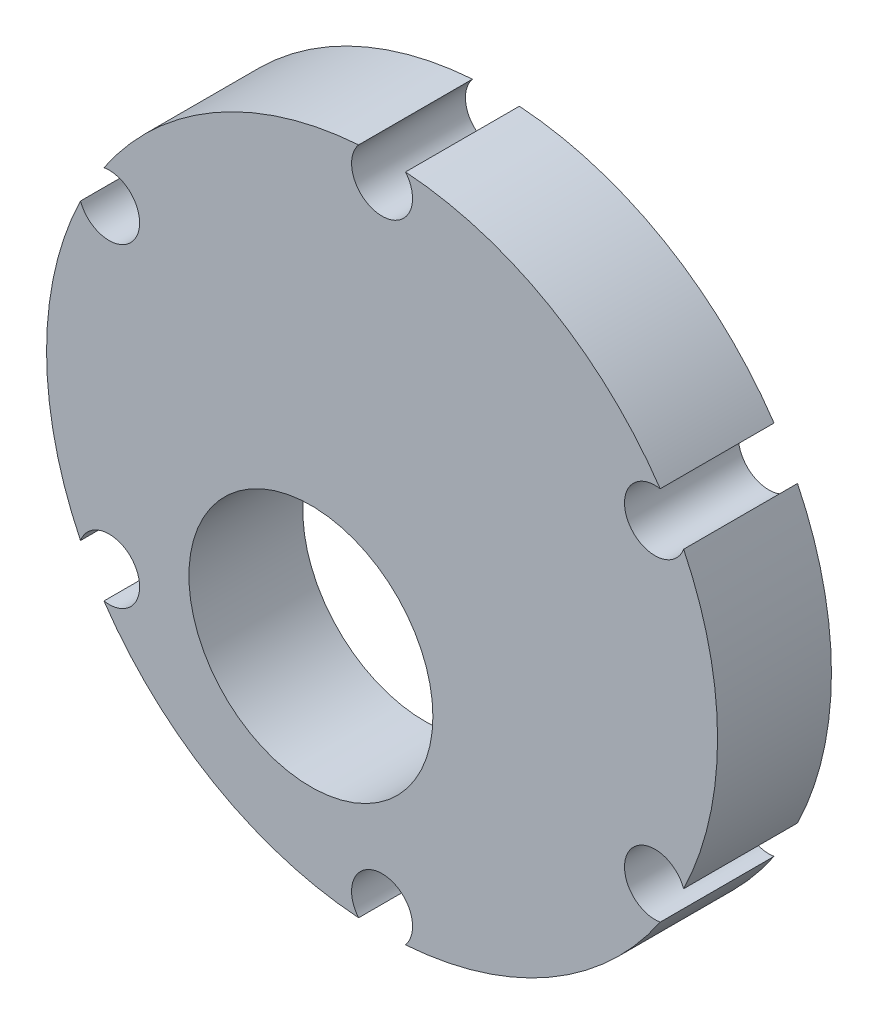
ISO-10303-21;
HEADER;
FILE_DESCRIPTION(('STEP AP214'),'2;1');
FILE_NAME('part.step','',(''),(''),'','','');
FILE_SCHEMA(('AUTOMOTIVE_DESIGN { 1 0 10303 214 1 1 1 1 }'));
ENDSEC;
DATA;
#1=APPLICATION_CONTEXT('core data for automotive mechanical design processes');
#2=APPLICATION_PROTOCOL_DEFINITION('international standard','automotive_design',2000,#1);
#3=PRODUCT_CONTEXT('',#1,'mechanical');
#4=PRODUCT('Part','Part','',(#3));
#5=PRODUCT_RELATED_PRODUCT_CATEGORY('part','',(#4));
#6=PRODUCT_DEFINITION_FORMATION('','',#4);
#7=PRODUCT_DEFINITION_CONTEXT('part definition',#1,'design');
#8=PRODUCT_DEFINITION('design','',#6,#7);
#9=PRODUCT_DEFINITION_SHAPE('','',#8);
#10=(LENGTH_UNIT() NAMED_UNIT(*) SI_UNIT(.MILLI.,.METRE.));
#11=(NAMED_UNIT(*) PLANE_ANGLE_UNIT() SI_UNIT($,.RADIAN.));
#12=(NAMED_UNIT(*) SI_UNIT($,.STERADIAN.) SOLID_ANGLE_UNIT());
#13=UNCERTAINTY_MEASURE_WITH_UNIT(LENGTH_MEASURE(1.E-05),#10,'distance_accuracy_value','');
#14=(GEOMETRIC_REPRESENTATION_CONTEXT(3) GLOBAL_UNCERTAINTY_ASSIGNED_CONTEXT((#13)) GLOBAL_UNIT_ASSIGNED_CONTEXT((#10,
#11,#12)) REPRESENTATION_CONTEXT('',''));
#15=CARTESIAN_POINT('',(0.,0.,0.));
#16=DIRECTION('',(0.,0.,1.));
#17=DIRECTION('',(1.,0.,0.));
#18=AXIS2_PLACEMENT_3D('',#15,#16,#17);
#19=CARTESIAN_POINT('',(0.,0.,5.6));
#20=DIRECTION('',(0.,0.,-1.));
#21=DIRECTION('',(-1.,0.,0.));
#22=AXIS2_PLACEMENT_3D('',#19,#20,#21);
#23=CYLINDRICAL_SURFACE('',#22,16.5);
#24=CARTESIAN_POINT('',(0.,0.,0.));
#25=DIRECTION('',(0.,0.,1.));
#26=DIRECTION('',(1.,0.,0.));
#27=AXIS2_PLACEMENT_3D('',#24,#25,#26);
#28=CIRCLE('',#27,16.5);
#29=CARTESIAN_POINT('',(14.8309142694271,-7.23145780136368,0.));
#30=VERTEX_POINT('',#29);
#31=CARTESIAN_POINT('',(14.8309142694271,7.23145780136372,0.));
#32=VERTEX_POINT('',#31);
#33=EDGE_CURVE('E212',#30,#32,#28,.T.);
#34=ORIENTED_EDGE('',*,*,#33,.T.);
#35=DIRECTION('',(0.,0.,1.));
#36=VECTOR('',#35,1.);
#37=CARTESIAN_POINT('',(14.8309142694271,7.23145780136372,2.8));
#38=LINE('',#37,#36);
#39=CARTESIAN_POINT('',(14.8309142694271,7.23145780136372,5.6));
#40=VERTEX_POINT('',#39);
#41=EDGE_CURVE('E48',#32,#40,#38,.T.);
#42=ORIENTED_EDGE('',*,*,#41,.T.);
#43=CARTESIAN_POINT('',(0.,0.,5.6));
#44=DIRECTION('',(0.,0.,1.));
#45=DIRECTION('',(1.,0.,0.));
#46=AXIS2_PLACEMENT_3D('',#43,#44,#45);
#47=CIRCLE('',#46,16.5);
#48=CARTESIAN_POINT('',(14.8309142694271,-7.23145780136368,5.6));
#49=VERTEX_POINT('',#48);
#50=EDGE_CURVE('E165',#49,#40,#47,.T.);
#51=ORIENTED_EDGE('',*,*,#50,.F.);
#52=DIRECTION('',(0.,0.,1.));
#53=VECTOR('',#52,1.);
#54=CARTESIAN_POINT('',(14.8309142694271,-7.23145780136368,2.8));
#55=LINE('',#54,#53);
#56=EDGE_CURVE('E189',#49,#30,#55,.F.);
#57=ORIENTED_EDGE('',*,*,#56,.T.);
#58=EDGE_LOOP('',(#34,#42,#51,#57));
#59=FACE_BOUND('',#58,.T.);
#60=ADVANCED_FACE('F33',(#59),#23,.T.);
#61=CARTESIAN_POINT('',(1.15283097233743,-16.4596774193548,0.));
#62=VERTEX_POINT('',#61);
#63=CARTESIAN_POINT('',(13.6780832970897,-9.22821961799116,0.));
#64=VERTEX_POINT('',#63);
#65=EDGE_CURVE('E154',#62,#64,#28,.T.);
#66=ORIENTED_EDGE('',*,*,#65,.T.);
#67=DIRECTION('',(0.,0.,1.));
#68=VECTOR('',#67,1.);
#69=CARTESIAN_POINT('',(13.6780832970897,-9.22821961799114,2.8));
#70=LINE('',#69,#68);
#71=CARTESIAN_POINT('',(13.6780832970897,-9.22821961799114,5.6));
#72=VERTEX_POINT('',#71);
#73=EDGE_CURVE('E56',#64,#72,#70,.T.);
#74=ORIENTED_EDGE('',*,*,#73,.T.);
#75=CARTESIAN_POINT('',(1.15283097233743,-16.4596774193548,5.6));
#76=VERTEX_POINT('',#75);
#77=EDGE_CURVE('E170',#76,#72,#47,.T.);
#78=ORIENTED_EDGE('',*,*,#77,.F.);
#79=DIRECTION('',(0.,0.,1.));
#80=VECTOR('',#79,1.);
#81=CARTESIAN_POINT('',(1.15283097233743,-16.4596774193548,2.8));
#82=LINE('',#81,#80);
#83=EDGE_CURVE('E190',#76,#62,#82,.F.);
#84=ORIENTED_EDGE('',*,*,#83,.T.);
#85=EDGE_LOOP('',(#66,#74,#78,#84));
#86=FACE_BOUND('',#85,.T.);
#87=ADVANCED_FACE('F219',(#86),#23,.T.);
#88=CARTESIAN_POINT('',(-13.6780832970896,-9.22821961799115,0.));
#89=VERTEX_POINT('',#88);
#90=CARTESIAN_POINT('',(-1.15283097233744,-16.4596774193548,0.));
#91=VERTEX_POINT('',#90);
#92=EDGE_CURVE('E149',#89,#91,#28,.T.);
#93=ORIENTED_EDGE('',*,*,#92,.T.);
#94=DIRECTION('',(0.,0.,1.));
#95=VECTOR('',#94,1.);
#96=CARTESIAN_POINT('',(-1.15283097233743,-16.4596774193548,2.8));
#97=LINE('',#96,#95);
#98=CARTESIAN_POINT('',(-1.15283097233743,-16.4596774193548,5.6));
#99=VERTEX_POINT('',#98);
#100=EDGE_CURVE('E187',#91,#99,#97,.T.);
#101=ORIENTED_EDGE('',*,*,#100,.T.);
#102=CARTESIAN_POINT('',(-13.6780832970896,-9.22821961799115,5.6));
#103=VERTEX_POINT('',#102);
#104=EDGE_CURVE('E164',#103,#99,#47,.T.);
#105=ORIENTED_EDGE('',*,*,#104,.F.);
#106=DIRECTION('',(0.,0.,1.));
#107=VECTOR('',#106,1.);
#108=CARTESIAN_POINT('',(-13.6780832970896,-9.22821961799115,2.8));
#109=LINE('',#108,#107);
#110=EDGE_CURVE('E186',#103,#89,#109,.F.);
#111=ORIENTED_EDGE('',*,*,#110,.T.);
#112=EDGE_LOOP('',(#93,#101,#105,#111));
#113=FACE_BOUND('',#112,.T.);
#114=ADVANCED_FACE('F185',(#113),#23,.T.);
#115=CARTESIAN_POINT('',(-14.8309142694271,7.23145780136367,0.));
#116=VERTEX_POINT('',#115);
#117=CARTESIAN_POINT('',(-14.8309142694271,-7.23145780136368,0.));
#118=VERTEX_POINT('',#117);
#119=EDGE_CURVE('E139',#116,#118,#28,.T.);
#120=ORIENTED_EDGE('',*,*,#119,.T.);
#121=DIRECTION('',(0.,0.,1.));
#122=VECTOR('',#121,1.);
#123=CARTESIAN_POINT('',(-14.8309142694271,-7.23145780136369,2.8));
#124=LINE('',#123,#122);
#125=CARTESIAN_POINT('',(-14.8309142694271,-7.23145780136369,5.6));
#126=VERTEX_POINT('',#125);
#127=EDGE_CURVE('E195',#118,#126,#124,.T.);
#128=ORIENTED_EDGE('',*,*,#127,.T.);
#129=CARTESIAN_POINT('',(-14.8309142694271,7.23145780136367,5.6));
#130=VERTEX_POINT('',#129);
#131=EDGE_CURVE('E141',#130,#126,#47,.T.);
#132=ORIENTED_EDGE('',*,*,#131,.F.);
#133=DIRECTION('',(0.,0.,1.));
#134=VECTOR('',#133,1.);
#135=CARTESIAN_POINT('',(-14.8309142694271,7.23145780136367,2.8));
#136=LINE('',#135,#134);
#137=EDGE_CURVE('E124',#130,#116,#136,.F.);
#138=ORIENTED_EDGE('',*,*,#137,.T.);
#139=EDGE_LOOP('',(#120,#128,#132,#138));
#140=FACE_BOUND('',#139,.T.);
#141=ADVANCED_FACE('F137',(#140),#23,.T.);
#142=CARTESIAN_POINT('',(-1.15283097233743,16.4596774193548,0.));
#143=VERTEX_POINT('',#142);
#144=CARTESIAN_POINT('',(-13.6780832970897,9.22821961799115,0.));
#145=VERTEX_POINT('',#144);
#146=EDGE_CURVE('E148',#143,#145,#28,.T.);
#147=ORIENTED_EDGE('',*,*,#146,.T.);
#148=DIRECTION('',(0.,0.,1.));
#149=VECTOR('',#148,1.);
#150=CARTESIAN_POINT('',(-13.6780832970897,9.22821961799113,2.8));
#151=LINE('',#150,#149);
#152=CARTESIAN_POINT('',(-13.6780832970897,9.22821961799113,5.6));
#153=VERTEX_POINT('',#152);
#154=EDGE_CURVE('E127',#145,#153,#151,.T.);
#155=ORIENTED_EDGE('',*,*,#154,.T.);
#156=CARTESIAN_POINT('',(-1.15283097233743,16.4596774193548,5.6));
#157=VERTEX_POINT('',#156);
#158=EDGE_CURVE('E157',#157,#153,#47,.T.);
#159=ORIENTED_EDGE('',*,*,#158,.F.);
#160=DIRECTION('',(0.,0.,1.));
#161=VECTOR('',#160,1.);
#162=CARTESIAN_POINT('',(-1.15283097233743,16.4596774193548,2.8));
#163=LINE('',#162,#161);
#164=EDGE_CURVE('E206',#157,#143,#163,.F.);
#165=ORIENTED_EDGE('',*,*,#164,.T.);
#166=EDGE_LOOP('',(#147,#155,#159,#165));
#167=FACE_BOUND('',#166,.T.);
#168=ADVANCED_FACE('F236',(#167),#23,.T.);
#169=CARTESIAN_POINT('',(13.6780832970897,9.22821961799114,5.6));
#170=VERTEX_POINT('',#169);
#171=CARTESIAN_POINT('',(1.15283097233743,16.4596774193548,5.6));
#172=VERTEX_POINT('',#171);
#173=EDGE_CURVE('E151',#170,#172,#47,.T.);
#174=ORIENTED_EDGE('',*,*,#173,.F.);
#175=DIRECTION('',(0.,0.,1.));
#176=VECTOR('',#175,1.);
#177=CARTESIAN_POINT('',(13.6780832970897,9.22821961799114,2.8));
#178=LINE('',#177,#176);
#179=CARTESIAN_POINT('',(13.6780832970897,9.22821961799114,0.));
#180=VERTEX_POINT('',#179);
#181=EDGE_CURVE('E200',#170,#180,#178,.F.);
#182=ORIENTED_EDGE('',*,*,#181,.T.);
#183=CARTESIAN_POINT('',(1.15283097233744,16.4596774193548,0.));
#184=VERTEX_POINT('',#183);
#185=EDGE_CURVE('E152',#180,#184,#28,.T.);
#186=ORIENTED_EDGE('',*,*,#185,.T.);
#187=DIRECTION('',(0.,0.,1.));
#188=VECTOR('',#187,1.);
#189=CARTESIAN_POINT('',(1.15283097233743,16.4596774193548,2.8));
#190=LINE('',#189,#188);
#191=EDGE_CURVE('E208',#184,#172,#190,.T.);
#192=ORIENTED_EDGE('',*,*,#191,.T.);
#193=EDGE_LOOP('',(#174,#182,#186,#192));
#194=FACE_BOUND('',#193,.T.);
#195=ADVANCED_FACE('F35',(#194),#23,.T.);
#196=CARTESIAN_POINT('',(0.,0.,5.6));
#197=DIRECTION('',(0.,0.,1.));
#198=DIRECTION('',(1.,0.,0.));
#199=AXIS2_PLACEMENT_3D('',#196,#197,#198);
#200=PLANE('',#199);
#201=CARTESIAN_POINT('',(-3.49999999999996,-6.06217782649109,5.6));
#202=DIRECTION('',(0.,0.,1.));
#203=DIRECTION('',(1.,0.,0.));
#204=AXIS2_PLACEMENT_3D('',#201,#202,#203);
#205=CIRCLE('',#204,6.);
#206=CARTESIAN_POINT('',(2.50000000000004,-6.06217782649109,5.6));
#207=VERTEX_POINT('',#206);
#208=EDGE_CURVE('E260',#207,#207,#205,.T.);
#209=ORIENTED_EDGE('',*,*,#208,.F.);
#210=EDGE_LOOP('',(#209));
#211=FACE_BOUND('',#210,.T.);
#212=CARTESIAN_POINT('',(13.4233937586588,7.75,5.6));
#213=DIRECTION('',(0.,0.,1.));
#214=DIRECTION('',(1.,0.,0.));
#215=AXIS2_PLACEMENT_3D('',#212,#213,#214);
#216=CIRCLE('',#215,1.5);
#217=EDGE_CURVE('E221',#170,#40,#216,.T.);
#218=ORIENTED_EDGE('',*,*,#217,.F.);
#219=ORIENTED_EDGE('',*,*,#173,.T.);
#220=CARTESIAN_POINT('',(0.,15.5,5.6));
#221=DIRECTION('',(0.,0.,1.));
#222=DIRECTION('',(1.,0.,0.));
#223=AXIS2_PLACEMENT_3D('',#220,#221,#222);
#224=CIRCLE('',#223,1.5);
#225=EDGE_CURVE('E204',#157,#172,#224,.T.);
#226=ORIENTED_EDGE('',*,*,#225,.F.);
#227=ORIENTED_EDGE('',*,*,#158,.T.);
#228=CARTESIAN_POINT('',(-13.4233937586588,7.74999999999999,5.6));
#229=DIRECTION('',(0.,0.,1.));
#230=DIRECTION('',(1.,0.,0.));
#231=AXIS2_PLACEMENT_3D('',#228,#229,#230);
#232=CIRCLE('',#231,1.5);
#233=EDGE_CURVE('E230',#130,#153,#232,.T.);
#234=ORIENTED_EDGE('',*,*,#233,.F.);
#235=ORIENTED_EDGE('',*,*,#131,.T.);
#236=CARTESIAN_POINT('',(-13.4233937586588,-7.75000000000001,5.6));
#237=DIRECTION('',(0.,0.,1.));
#238=DIRECTION('',(1.,0.,0.));
#239=AXIS2_PLACEMENT_3D('',#236,#237,#238);
#240=CIRCLE('',#239,1.5);
#241=EDGE_CURVE('E181',#103,#126,#240,.T.);
#242=ORIENTED_EDGE('',*,*,#241,.F.);
#243=ORIENTED_EDGE('',*,*,#104,.T.);
#244=CARTESIAN_POINT('',(0.,-15.5,5.6));
#245=DIRECTION('',(0.,0.,1.));
#246=DIRECTION('',(1.,0.,0.));
#247=AXIS2_PLACEMENT_3D('',#244,#245,#246);
#248=CIRCLE('',#247,1.5);
#249=EDGE_CURVE('E180',#76,#99,#248,.T.);
#250=ORIENTED_EDGE('',*,*,#249,.F.);
#251=ORIENTED_EDGE('',*,*,#77,.T.);
#252=CARTESIAN_POINT('',(13.4233937586588,-7.75,5.6));
#253=DIRECTION('',(0.,0.,1.));
#254=DIRECTION('',(1.,0.,0.));
#255=AXIS2_PLACEMENT_3D('',#252,#253,#254);
#256=CIRCLE('',#255,1.5);
#257=EDGE_CURVE('E222',#49,#72,#256,.T.);
#258=ORIENTED_EDGE('',*,*,#257,.F.);
#259=ORIENTED_EDGE('',*,*,#50,.T.);
#260=EDGE_LOOP('',(#218,#219,#226,#227,#234,#235,#242,#243,#250,#251,#258,#259));
#261=FACE_BOUND('',#260,.T.);
#262=ADVANCED_FACE('F179',(#211,#261),#200,.T.);
#263=CARTESIAN_POINT('',(0.,0.,0.));
#264=DIRECTION('',(0.,0.,1.));
#265=DIRECTION('',(1.,0.,0.));
#266=AXIS2_PLACEMENT_3D('',#263,#264,#265);
#267=PLANE('',#266);
#268=CARTESIAN_POINT('',(-3.49999999999996,-6.06217782649109,0.));
#269=DIRECTION('',(0.,0.,1.));
#270=DIRECTION('',(1.,0.,0.));
#271=AXIS2_PLACEMENT_3D('',#268,#269,#270);
#272=CIRCLE('',#271,6.);
#273=CARTESIAN_POINT('',(2.50000000000004,-6.06217782649109,0.));
#274=VERTEX_POINT('',#273);
#275=EDGE_CURVE('E231',#274,#274,#272,.T.);
#276=ORIENTED_EDGE('',*,*,#275,.T.);
#277=EDGE_LOOP('',(#276));
#278=FACE_BOUND('',#277,.T.);
#279=ORIENTED_EDGE('',*,*,#185,.F.);
#280=CARTESIAN_POINT('',(13.4233937586588,7.75,0.));
#281=DIRECTION('',(0.,0.,1.));
#282=DIRECTION('',(1.,0.,0.));
#283=AXIS2_PLACEMENT_3D('',#280,#281,#282);
#284=CIRCLE('',#283,1.5);
#285=EDGE_CURVE('E142',#180,#32,#284,.T.);
#286=ORIENTED_EDGE('',*,*,#285,.T.);
#287=ORIENTED_EDGE('',*,*,#33,.F.);
#288=CARTESIAN_POINT('',(13.4233937586588,-7.75,0.));
#289=DIRECTION('',(0.,0.,1.));
#290=DIRECTION('',(1.,0.,0.));
#291=AXIS2_PLACEMENT_3D('',#288,#289,#290);
#292=CIRCLE('',#291,1.5);
#293=EDGE_CURVE('E220',#30,#64,#292,.T.);
#294=ORIENTED_EDGE('',*,*,#293,.T.);
#295=ORIENTED_EDGE('',*,*,#65,.F.);
#296=CARTESIAN_POINT('',(0.,-15.5,0.));
#297=DIRECTION('',(0.,0.,1.));
#298=DIRECTION('',(1.,0.,0.));
#299=AXIS2_PLACEMENT_3D('',#296,#297,#298);
#300=CIRCLE('',#299,1.5);
#301=EDGE_CURVE('E11',#62,#91,#300,.T.);
#302=ORIENTED_EDGE('',*,*,#301,.T.);
#303=ORIENTED_EDGE('',*,*,#92,.F.);
#304=CARTESIAN_POINT('',(-13.4233937586588,-7.75000000000001,0.));
#305=DIRECTION('',(0.,0.,1.));
#306=DIRECTION('',(1.,0.,0.));
#307=AXIS2_PLACEMENT_3D('',#304,#305,#306);
#308=CIRCLE('',#307,1.5);
#309=EDGE_CURVE('E41',#89,#118,#308,.T.);
#310=ORIENTED_EDGE('',*,*,#309,.T.);
#311=ORIENTED_EDGE('',*,*,#119,.F.);
#312=CARTESIAN_POINT('',(-13.4233937586588,7.74999999999999,0.));
#313=DIRECTION('',(0.,0.,1.));
#314=DIRECTION('',(1.,0.,0.));
#315=AXIS2_PLACEMENT_3D('',#312,#313,#314);
#316=CIRCLE('',#315,1.5);
#317=EDGE_CURVE('E121',#116,#145,#316,.T.);
#318=ORIENTED_EDGE('',*,*,#317,.T.);
#319=ORIENTED_EDGE('',*,*,#146,.F.);
#320=CARTESIAN_POINT('',(0.,15.5,0.));
#321=DIRECTION('',(0.,0.,1.));
#322=DIRECTION('',(1.,0.,0.));
#323=AXIS2_PLACEMENT_3D('',#320,#321,#322);
#324=CIRCLE('',#323,1.5);
#325=EDGE_CURVE('E132',#143,#184,#324,.T.);
#326=ORIENTED_EDGE('',*,*,#325,.T.);
#327=EDGE_LOOP('',(#279,#286,#287,#294,#295,#302,#303,#310,#311,#318,#319,#326));
#328=FACE_BOUND('',#327,.T.);
#329=ADVANCED_FACE('F146',(#278,#328),#267,.F.);
#330=CARTESIAN_POINT('',(0.,15.5,0.));
#331=DIRECTION('',(0.,0.,1.));
#332=DIRECTION('',(1.,0.,0.));
#333=AXIS2_PLACEMENT_3D('',#330,#331,#332);
#334=CYLINDRICAL_SURFACE('',#333,1.5);
#335=ORIENTED_EDGE('',*,*,#325,.F.);
#336=ORIENTED_EDGE('',*,*,#164,.F.);
#337=ORIENTED_EDGE('',*,*,#225,.T.);
#338=ORIENTED_EDGE('',*,*,#191,.F.);
#339=EDGE_LOOP('',(#335,#336,#337,#338));
#340=FACE_BOUND('',#339,.T.);
#341=ADVANCED_FACE('F238',(#340),#334,.F.);
#342=CARTESIAN_POINT('',(-13.4233937586588,7.74999999999999,0.));
#343=DIRECTION('',(0.,0.,1.));
#344=DIRECTION('',(1.,0.,0.));
#345=AXIS2_PLACEMENT_3D('',#342,#343,#344);
#346=CYLINDRICAL_SURFACE('',#345,1.5);
#347=ORIENTED_EDGE('',*,*,#317,.F.);
#348=ORIENTED_EDGE('',*,*,#137,.F.);
#349=ORIENTED_EDGE('',*,*,#233,.T.);
#350=ORIENTED_EDGE('',*,*,#154,.F.);
#351=EDGE_LOOP('',(#347,#348,#349,#350));
#352=FACE_BOUND('',#351,.T.);
#353=ADVANCED_FACE('F123',(#352),#346,.F.);
#354=CARTESIAN_POINT('',(-13.4233937586588,-7.75000000000001,0.));
#355=DIRECTION('',(0.,0.,1.));
#356=DIRECTION('',(1.,0.,0.));
#357=AXIS2_PLACEMENT_3D('',#354,#355,#356);
#358=CYLINDRICAL_SURFACE('',#357,1.5);
#359=ORIENTED_EDGE('',*,*,#309,.F.);
#360=ORIENTED_EDGE('',*,*,#110,.F.);
#361=ORIENTED_EDGE('',*,*,#241,.T.);
#362=ORIENTED_EDGE('',*,*,#127,.F.);
#363=EDGE_LOOP('',(#359,#360,#361,#362));
#364=FACE_BOUND('',#363,.T.);
#365=ADVANCED_FACE('F245',(#364),#358,.F.);
#366=CARTESIAN_POINT('',(0.,-15.5,0.));
#367=DIRECTION('',(0.,0.,1.));
#368=DIRECTION('',(1.,0.,0.));
#369=AXIS2_PLACEMENT_3D('',#366,#367,#368);
#370=CYLINDRICAL_SURFACE('',#369,1.5);
#371=ORIENTED_EDGE('',*,*,#301,.F.);
#372=ORIENTED_EDGE('',*,*,#83,.F.);
#373=ORIENTED_EDGE('',*,*,#249,.T.);
#374=ORIENTED_EDGE('',*,*,#100,.F.);
#375=EDGE_LOOP('',(#371,#372,#373,#374));
#376=FACE_BOUND('',#375,.T.);
#377=ADVANCED_FACE('F280',(#376),#370,.F.);
#378=CARTESIAN_POINT('',(13.4233937586588,-7.75,0.));
#379=DIRECTION('',(0.,0.,1.));
#380=DIRECTION('',(1.,0.,0.));
#381=AXIS2_PLACEMENT_3D('',#378,#379,#380);
#382=CYLINDRICAL_SURFACE('',#381,1.5);
#383=ORIENTED_EDGE('',*,*,#293,.F.);
#384=ORIENTED_EDGE('',*,*,#56,.F.);
#385=ORIENTED_EDGE('',*,*,#257,.T.);
#386=ORIENTED_EDGE('',*,*,#73,.F.);
#387=EDGE_LOOP('',(#383,#384,#385,#386));
#388=FACE_BOUND('',#387,.T.);
#389=ADVANCED_FACE('F275',(#388),#382,.F.);
#390=CARTESIAN_POINT('',(13.4233937586588,7.75,0.));
#391=DIRECTION('',(0.,0.,1.));
#392=DIRECTION('',(1.,0.,0.));
#393=AXIS2_PLACEMENT_3D('',#390,#391,#392);
#394=CYLINDRICAL_SURFACE('',#393,1.5);
#395=ORIENTED_EDGE('',*,*,#285,.F.);
#396=ORIENTED_EDGE('',*,*,#181,.F.);
#397=ORIENTED_EDGE('',*,*,#217,.T.);
#398=ORIENTED_EDGE('',*,*,#41,.F.);
#399=EDGE_LOOP('',(#395,#396,#397,#398));
#400=FACE_BOUND('',#399,.T.);
#401=ADVANCED_FACE('F269',(#400),#394,.F.);
#402=CARTESIAN_POINT('',(-3.49999999999996,-6.06217782649109,0.));
#403=DIRECTION('',(0.,0.,1.));
#404=DIRECTION('',(1.,0.,0.));
#405=AXIS2_PLACEMENT_3D('',#402,#403,#404);
#406=CYLINDRICAL_SURFACE('',#405,6.);
#407=ORIENTED_EDGE('',*,*,#275,.F.);
#408=EDGE_LOOP('',(#407));
#409=FACE_BOUND('',#408,.T.);
#410=ORIENTED_EDGE('',*,*,#208,.T.);
#411=EDGE_LOOP('',(#410));
#412=FACE_BOUND('',#411,.T.);
#413=ADVANCED_FACE('F266',(#409,#412),#406,.F.);
#414=CLOSED_SHELL('',(#60,#87,#114,#141,#168,#195,#262,#329,#341,#353,#365,#377,#389,#401,#413));
#415=MANIFOLD_SOLID_BREP('B2',#414);
#416=ADVANCED_BREP_SHAPE_REPRESENTATION('',(#18,#415),#14);
#417=SHAPE_DEFINITION_REPRESENTATION(#9,#416);
ENDSEC;
END-ISO-10303-21;
